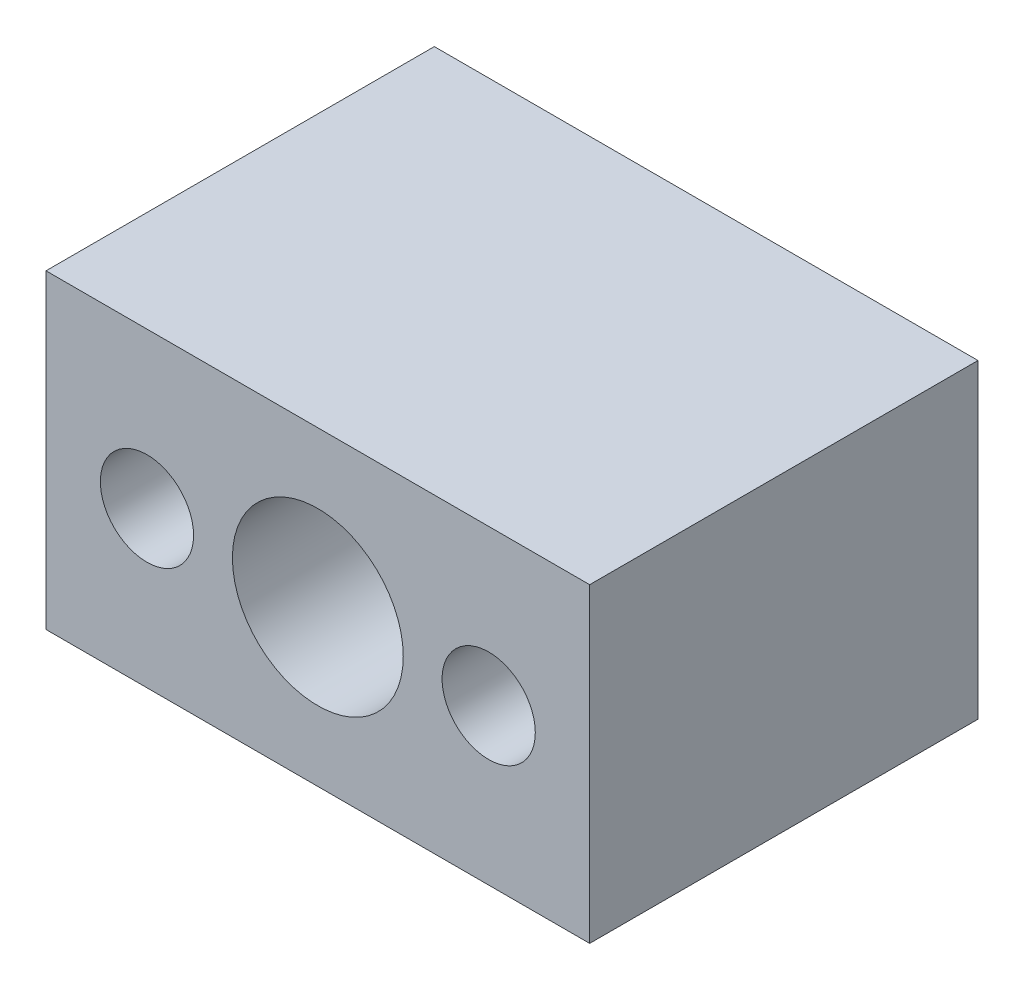
ISO-10303-21;
HEADER;
FILE_DESCRIPTION(('STEP AP214'),'2;1');
FILE_NAME('part.step','',(''),(''),'','','');
FILE_SCHEMA(('AUTOMOTIVE_DESIGN { 1 0 10303 214 1 1 1 1 }'));
ENDSEC;
DATA;
#1=APPLICATION_CONTEXT('core data for automotive mechanical design processes');
#2=APPLICATION_PROTOCOL_DEFINITION('international standard','automotive_design',2000,#1);
#3=PRODUCT_CONTEXT('',#1,'mechanical');
#4=PRODUCT('Part','Part','',(#3));
#5=PRODUCT_RELATED_PRODUCT_CATEGORY('part','',(#4));
#6=PRODUCT_DEFINITION_FORMATION('','',#4);
#7=PRODUCT_DEFINITION_CONTEXT('part definition',#1,'design');
#8=PRODUCT_DEFINITION('design','',#6,#7);
#9=PRODUCT_DEFINITION_SHAPE('','',#8);
#10=(LENGTH_UNIT() NAMED_UNIT(*) SI_UNIT(.MILLI.,.METRE.));
#11=(NAMED_UNIT(*) PLANE_ANGLE_UNIT() SI_UNIT($,.RADIAN.));
#12=(NAMED_UNIT(*) SI_UNIT($,.STERADIAN.) SOLID_ANGLE_UNIT());
#13=UNCERTAINTY_MEASURE_WITH_UNIT(LENGTH_MEASURE(1.E-05),#10,'distance_accuracy_value','');
#14=(GEOMETRIC_REPRESENTATION_CONTEXT(3) GLOBAL_UNCERTAINTY_ASSIGNED_CONTEXT((#13)) GLOBAL_UNIT_ASSIGNED_CONTEXT((#10,
#11,#12)) REPRESENTATION_CONTEXT('',''));
#15=CARTESIAN_POINT('',(0.,0.,0.));
#16=DIRECTION('',(0.,0.,1.));
#17=DIRECTION('',(1.,0.,0.));
#18=AXIS2_PLACEMENT_3D('',#15,#16,#17);
#19=CARTESIAN_POINT('',(35.,20.,50.));
#20=DIRECTION('',(-1.,0.,0.));
#21=DIRECTION('',(0.,0.,1.));
#22=AXIS2_PLACEMENT_3D('',#19,#20,#21);
#23=PLANE('',#22);
#24=DIRECTION('',(0.,1.,0.));
#25=VECTOR('',#24,1.);
#26=CARTESIAN_POINT('',(35.,20.,0.));
#27=LINE('',#26,#25);
#28=CARTESIAN_POINT('',(35.,-20.,0.));
#29=VERTEX_POINT('',#28);
#30=CARTESIAN_POINT('',(35.,20.,0.));
#31=VERTEX_POINT('',#30);
#32=EDGE_CURVE('E96',#29,#31,#27,.T.);
#33=ORIENTED_EDGE('',*,*,#32,.T.);
#34=DIRECTION('',(0.,0.,-1.));
#35=VECTOR('',#34,1.);
#36=CARTESIAN_POINT('',(35.,20.,50.));
#37=LINE('',#36,#35);
#38=CARTESIAN_POINT('',(35.,20.,50.));
#39=VERTEX_POINT('',#38);
#40=EDGE_CURVE('E11',#39,#31,#37,.T.);
#41=ORIENTED_EDGE('',*,*,#40,.F.);
#42=DIRECTION('',(0.,1.,0.));
#43=VECTOR('',#42,1.);
#44=CARTESIAN_POINT('',(35.,20.,50.));
#45=LINE('',#44,#43);
#46=CARTESIAN_POINT('',(35.,-20.,50.));
#47=VERTEX_POINT('',#46);
#48=EDGE_CURVE('E84',#47,#39,#45,.T.);
#49=ORIENTED_EDGE('',*,*,#48,.F.);
#50=DIRECTION('',(0.,0.,-1.));
#51=VECTOR('',#50,1.);
#52=CARTESIAN_POINT('',(35.,-20.,50.));
#53=LINE('',#52,#51);
#54=EDGE_CURVE('E92',#47,#29,#53,.T.);
#55=ORIENTED_EDGE('',*,*,#54,.T.);
#56=EDGE_LOOP('',(#33,#41,#49,#55));
#57=FACE_BOUND('',#56,.T.);
#58=ADVANCED_FACE('F33',(#57),#23,.F.);
#59=CARTESIAN_POINT('',(-35.,20.,50.));
#60=DIRECTION('',(0.,-1.,0.));
#61=DIRECTION('',(0.,0.,-1.));
#62=AXIS2_PLACEMENT_3D('',#59,#60,#61);
#63=PLANE('',#62);
#64=DIRECTION('',(-1.,0.,0.));
#65=VECTOR('',#64,1.);
#66=CARTESIAN_POINT('',(-35.,20.,0.));
#67=LINE('',#66,#65);
#68=CARTESIAN_POINT('',(-35.,20.,0.));
#69=VERTEX_POINT('',#68);
#70=EDGE_CURVE('E88',#31,#69,#67,.T.);
#71=ORIENTED_EDGE('',*,*,#70,.T.);
#72=DIRECTION('',(0.,0.,-1.));
#73=VECTOR('',#72,1.);
#74=CARTESIAN_POINT('',(-35.,20.,50.));
#75=LINE('',#74,#73);
#76=CARTESIAN_POINT('',(-35.,20.,50.));
#77=VERTEX_POINT('',#76);
#78=EDGE_CURVE('E41',#77,#69,#75,.T.);
#79=ORIENTED_EDGE('',*,*,#78,.F.);
#80=DIRECTION('',(-1.,0.,0.));
#81=VECTOR('',#80,1.);
#82=CARTESIAN_POINT('',(-35.,20.,50.));
#83=LINE('',#82,#81);
#84=EDGE_CURVE('E79',#39,#77,#83,.T.);
#85=ORIENTED_EDGE('',*,*,#84,.F.);
#86=ORIENTED_EDGE('',*,*,#40,.T.);
#87=EDGE_LOOP('',(#71,#79,#85,#86));
#88=FACE_BOUND('',#87,.T.);
#89=ADVANCED_FACE('F87',(#88),#63,.F.);
#90=CARTESIAN_POINT('',(-35.,20.,50.));
#91=DIRECTION('',(1.,0.,0.));
#92=DIRECTION('',(0.,0.,-1.));
#93=AXIS2_PLACEMENT_3D('',#90,#91,#92);
#94=PLANE('',#93);
#95=DIRECTION('',(0.,-1.,0.));
#96=VECTOR('',#95,1.);
#97=CARTESIAN_POINT('',(-35.,20.,0.));
#98=LINE('',#97,#96);
#99=CARTESIAN_POINT('',(-35.,-20.,0.));
#100=VERTEX_POINT('',#99);
#101=EDGE_CURVE('E66',#69,#100,#98,.T.);
#102=ORIENTED_EDGE('',*,*,#101,.T.);
#103=DIRECTION('',(0.,0.,-1.));
#104=VECTOR('',#103,1.);
#105=CARTESIAN_POINT('',(-35.,-20.,50.));
#106=LINE('',#105,#104);
#107=CARTESIAN_POINT('',(-35.,-20.,50.));
#108=VERTEX_POINT('',#107);
#109=EDGE_CURVE('E89',#108,#100,#106,.T.);
#110=ORIENTED_EDGE('',*,*,#109,.F.);
#111=DIRECTION('',(0.,-1.,0.));
#112=VECTOR('',#111,1.);
#113=CARTESIAN_POINT('',(-35.,20.,50.));
#114=LINE('',#113,#112);
#115=EDGE_CURVE('E82',#77,#108,#114,.T.);
#116=ORIENTED_EDGE('',*,*,#115,.F.);
#117=ORIENTED_EDGE('',*,*,#78,.T.);
#118=EDGE_LOOP('',(#102,#110,#116,#117));
#119=FACE_BOUND('',#118,.T.);
#120=ADVANCED_FACE('F90',(#119),#94,.F.);
#121=CARTESIAN_POINT('',(-35.,-20.,50.));
#122=DIRECTION('',(0.,1.,0.));
#123=DIRECTION('',(0.,0.,1.));
#124=AXIS2_PLACEMENT_3D('',#121,#122,#123);
#125=PLANE('',#124);
#126=DIRECTION('',(1.,0.,0.));
#127=VECTOR('',#126,1.);
#128=CARTESIAN_POINT('',(-35.,-20.,0.));
#129=LINE('',#128,#127);
#130=EDGE_CURVE('E72',#100,#29,#129,.T.);
#131=ORIENTED_EDGE('',*,*,#130,.T.);
#132=ORIENTED_EDGE('',*,*,#54,.F.);
#133=DIRECTION('',(1.,0.,0.));
#134=VECTOR('',#133,1.);
#135=CARTESIAN_POINT('',(-35.,-20.,50.));
#136=LINE('',#135,#134);
#137=EDGE_CURVE('E49',#108,#47,#136,.T.);
#138=ORIENTED_EDGE('',*,*,#137,.F.);
#139=ORIENTED_EDGE('',*,*,#109,.T.);
#140=EDGE_LOOP('',(#131,#132,#138,#139));
#141=FACE_BOUND('',#140,.T.);
#142=ADVANCED_FACE('F104',(#141),#125,.F.);
#143=CARTESIAN_POINT('',(0.,0.,50.));
#144=DIRECTION('',(0.,0.,1.));
#145=DIRECTION('',(1.,0.,0.));
#146=AXIS2_PLACEMENT_3D('',#143,#144,#145);
#147=PLANE('',#146);
#148=CARTESIAN_POINT('',(22.,0.,50.));
#149=DIRECTION('',(0.,0.,1.));
#150=DIRECTION('',(1.,0.,0.));
#151=AXIS2_PLACEMENT_3D('',#148,#149,#150);
#152=CIRCLE('',#151,6.);
#153=CARTESIAN_POINT('',(28.,0.,50.));
#154=VERTEX_POINT('',#153);
#155=EDGE_CURVE('E122',#154,#154,#152,.T.);
#156=ORIENTED_EDGE('',*,*,#155,.F.);
#157=EDGE_LOOP('',(#156));
#158=FACE_BOUND('',#157,.T.);
#159=CARTESIAN_POINT('',(-22.,0.,50.));
#160=DIRECTION('',(0.,0.,1.));
#161=DIRECTION('',(1.,0.,0.));
#162=AXIS2_PLACEMENT_3D('',#159,#160,#161);
#163=CIRCLE('',#162,6.);
#164=CARTESIAN_POINT('',(-16.,0.,50.));
#165=VERTEX_POINT('',#164);
#166=EDGE_CURVE('E116',#165,#165,#163,.T.);
#167=ORIENTED_EDGE('',*,*,#166,.F.);
#168=EDGE_LOOP('',(#167));
#169=FACE_BOUND('',#168,.T.);
#170=CARTESIAN_POINT('',(0.,0.,50.));
#171=DIRECTION('',(0.,0.,1.));
#172=DIRECTION('',(1.,0.,0.));
#173=AXIS2_PLACEMENT_3D('',#170,#171,#172);
#174=CIRCLE('',#173,11.);
#175=CARTESIAN_POINT('',(11.,0.,50.));
#176=VERTEX_POINT('',#175);
#177=EDGE_CURVE('E110',#176,#176,#174,.T.);
#178=ORIENTED_EDGE('',*,*,#177,.F.);
#179=EDGE_LOOP('',(#178));
#180=FACE_BOUND('',#179,.T.);
#181=ORIENTED_EDGE('',*,*,#48,.T.);
#182=ORIENTED_EDGE('',*,*,#84,.T.);
#183=ORIENTED_EDGE('',*,*,#115,.T.);
#184=ORIENTED_EDGE('',*,*,#137,.T.);
#185=EDGE_LOOP('',(#181,#182,#183,#184));
#186=FACE_BOUND('',#185,.T.);
#187=ADVANCED_FACE('F80',(#158,#169,#180,#186),#147,.T.);
#188=CARTESIAN_POINT('',(0.,0.,0.));
#189=DIRECTION('',(0.,0.,1.));
#190=DIRECTION('',(1.,0.,0.));
#191=AXIS2_PLACEMENT_3D('',#188,#189,#190);
#192=PLANE('',#191);
#193=CARTESIAN_POINT('',(22.,0.,0.));
#194=DIRECTION('',(0.,0.,1.));
#195=DIRECTION('',(1.,0.,0.));
#196=AXIS2_PLACEMENT_3D('',#193,#194,#195);
#197=CIRCLE('',#196,6.);
#198=CARTESIAN_POINT('',(28.,0.,0.));
#199=VERTEX_POINT('',#198);
#200=EDGE_CURVE('E119',#199,#199,#197,.T.);
#201=ORIENTED_EDGE('',*,*,#200,.T.);
#202=EDGE_LOOP('',(#201));
#203=FACE_BOUND('',#202,.T.);
#204=CARTESIAN_POINT('',(-22.,0.,0.));
#205=DIRECTION('',(0.,0.,1.));
#206=DIRECTION('',(1.,0.,0.));
#207=AXIS2_PLACEMENT_3D('',#204,#205,#206);
#208=CIRCLE('',#207,6.);
#209=CARTESIAN_POINT('',(-16.,0.,0.));
#210=VERTEX_POINT('',#209);
#211=EDGE_CURVE('E113',#210,#210,#208,.T.);
#212=ORIENTED_EDGE('',*,*,#211,.T.);
#213=EDGE_LOOP('',(#212));
#214=FACE_BOUND('',#213,.T.);
#215=CARTESIAN_POINT('',(0.,0.,0.));
#216=DIRECTION('',(0.,0.,1.));
#217=DIRECTION('',(1.,0.,0.));
#218=AXIS2_PLACEMENT_3D('',#215,#216,#217);
#219=CIRCLE('',#218,11.);
#220=CARTESIAN_POINT('',(11.,0.,0.));
#221=VERTEX_POINT('',#220);
#222=EDGE_CURVE('E99',#221,#221,#219,.T.);
#223=ORIENTED_EDGE('',*,*,#222,.T.);
#224=EDGE_LOOP('',(#223));
#225=FACE_BOUND('',#224,.T.);
#226=ORIENTED_EDGE('',*,*,#32,.F.);
#227=ORIENTED_EDGE('',*,*,#130,.F.);
#228=ORIENTED_EDGE('',*,*,#101,.F.);
#229=ORIENTED_EDGE('',*,*,#70,.F.);
#230=EDGE_LOOP('',(#226,#227,#228,#229));
#231=FACE_BOUND('',#230,.T.);
#232=ADVANCED_FACE('F107',(#203,#214,#225,#231),#192,.F.);
#233=CARTESIAN_POINT('',(0.,0.,0.));
#234=DIRECTION('',(0.,0.,1.));
#235=DIRECTION('',(1.,0.,0.));
#236=AXIS2_PLACEMENT_3D('',#233,#234,#235);
#237=CYLINDRICAL_SURFACE('',#236,11.);
#238=ORIENTED_EDGE('',*,*,#222,.F.);
#239=EDGE_LOOP('',(#238));
#240=FACE_BOUND('',#239,.T.);
#241=ORIENTED_EDGE('',*,*,#177,.T.);
#242=EDGE_LOOP('',(#241));
#243=FACE_BOUND('',#242,.T.);
#244=ADVANCED_FACE('F144',(#240,#243),#237,.F.);
#245=CARTESIAN_POINT('',(-22.,0.,0.));
#246=DIRECTION('',(0.,0.,1.));
#247=DIRECTION('',(1.,0.,0.));
#248=AXIS2_PLACEMENT_3D('',#245,#246,#247);
#249=CYLINDRICAL_SURFACE('',#248,6.);
#250=ORIENTED_EDGE('',*,*,#211,.F.);
#251=EDGE_LOOP('',(#250));
#252=FACE_BOUND('',#251,.T.);
#253=ORIENTED_EDGE('',*,*,#166,.T.);
#254=EDGE_LOOP('',(#253));
#255=FACE_BOUND('',#254,.T.);
#256=ADVANCED_FACE('F133',(#252,#255),#249,.F.);
#257=CARTESIAN_POINT('',(22.,0.,0.));
#258=DIRECTION('',(0.,0.,1.));
#259=DIRECTION('',(1.,0.,0.));
#260=AXIS2_PLACEMENT_3D('',#257,#258,#259);
#261=CYLINDRICAL_SURFACE('',#260,6.);
#262=ORIENTED_EDGE('',*,*,#200,.F.);
#263=EDGE_LOOP('',(#262));
#264=FACE_BOUND('',#263,.T.);
#265=ORIENTED_EDGE('',*,*,#155,.T.);
#266=EDGE_LOOP('',(#265));
#267=FACE_BOUND('',#266,.T.);
#268=ADVANCED_FACE('F130',(#264,#267),#261,.F.);
#269=CLOSED_SHELL('',(#58,#89,#120,#142,#187,#232,#244,#256,#268));
#270=MANIFOLD_SOLID_BREP('B2',#269);
#271=ADVANCED_BREP_SHAPE_REPRESENTATION('',(#18,#270),#14);
#272=SHAPE_DEFINITION_REPRESENTATION(#9,#271);
ENDSEC;
END-ISO-10303-21;
